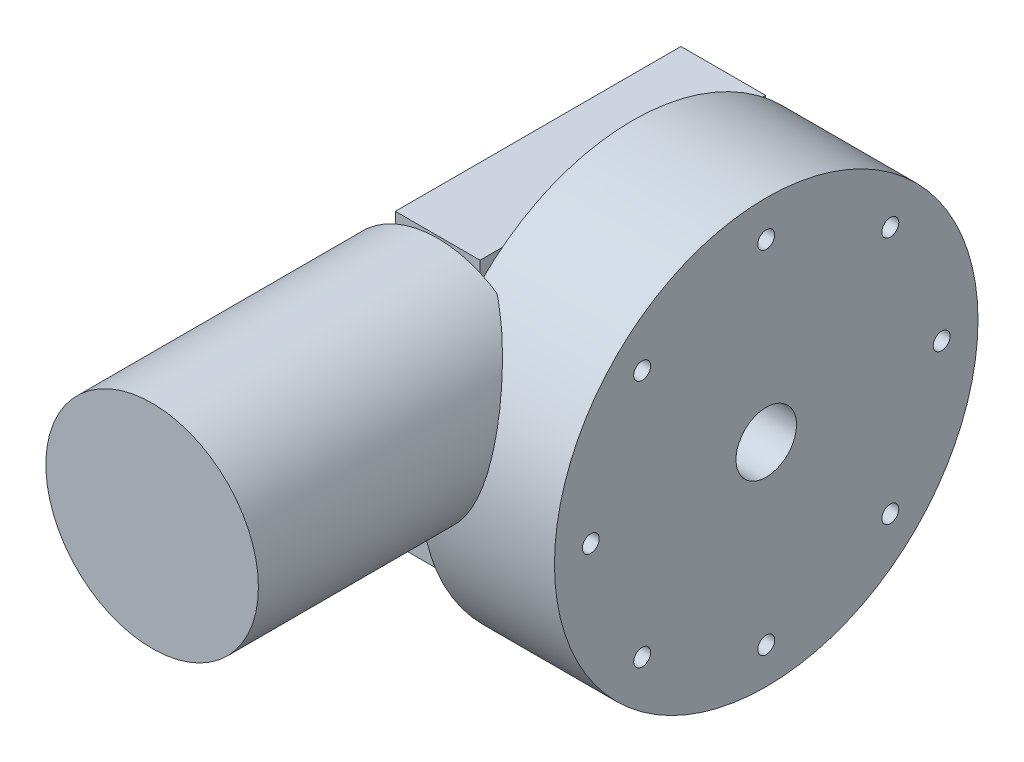
ISO-10303-21;
HEADER;
FILE_DESCRIPTION(('STEP AP214'),'2;1');
FILE_NAME('part.step','',(''),(''),'','','');
FILE_SCHEMA(('AUTOMOTIVE_DESIGN { 1 0 10303 214 1 1 1 1 }'));
ENDSEC;
DATA;
#1=APPLICATION_CONTEXT('core data for automotive mechanical design processes');
#2=APPLICATION_PROTOCOL_DEFINITION('international standard','automotive_design',2000,#1);
#3=PRODUCT_CONTEXT('',#1,'mechanical');
#4=PRODUCT('Part','Part','',(#3));
#5=PRODUCT_RELATED_PRODUCT_CATEGORY('part','',(#4));
#6=PRODUCT_DEFINITION_FORMATION('','',#4);
#7=PRODUCT_DEFINITION_CONTEXT('part definition',#1,'design');
#8=PRODUCT_DEFINITION('design','',#6,#7);
#9=PRODUCT_DEFINITION_SHAPE('','',#8);
#10=(LENGTH_UNIT() NAMED_UNIT(*) SI_UNIT(.MILLI.,.METRE.));
#11=(NAMED_UNIT(*) PLANE_ANGLE_UNIT() SI_UNIT($,.RADIAN.));
#12=(NAMED_UNIT(*) SI_UNIT($,.STERADIAN.) SOLID_ANGLE_UNIT());
#13=UNCERTAINTY_MEASURE_WITH_UNIT(LENGTH_MEASURE(1.E-05),#10,'distance_accuracy_value','');
#14=(GEOMETRIC_REPRESENTATION_CONTEXT(3) GLOBAL_UNCERTAINTY_ASSIGNED_CONTEXT((#13)) GLOBAL_UNIT_ASSIGNED_CONTEXT((#10,
#11,#12)) REPRESENTATION_CONTEXT('',''));
#15=CARTESIAN_POINT('',(0.,0.,0.));
#16=DIRECTION('',(0.,0.,1.));
#17=DIRECTION('',(1.,0.,0.));
#18=AXIS2_PLACEMENT_3D('',#15,#16,#17);
#19=CARTESIAN_POINT('',(-70.,-100.523478567222,126.));
#20=DIRECTION('',(0.,0.,1.));
#21=DIRECTION('',(1.,0.,0.));
#22=AXIS2_PLACEMENT_3D('',#19,#20,#21);
#23=PLANE('',#22);
#24=CARTESIAN_POINT('',(-35.,48.3972012518398,126.));
#25=DIRECTION('',(0.,0.,1.));
#26=DIRECTION('',(1.,0.,0.));
#27=AXIS2_PLACEMENT_3D('',#24,#25,#26);
#28=CIRCLE('',#27,87.8280680463615);
#29=CARTESIAN_POINT('',(0.,128.950100248439,126.));
#30=VERTEX_POINT('',#29);
#31=CARTESIAN_POINT('',(-70.,128.950100248439,126.));
#32=VERTEX_POINT('',#31);
#33=EDGE_CURVE('E52',#30,#32,#28,.T.);
#34=ORIENTED_EDGE('',*,*,#33,.F.);
#35=DIRECTION('',(0.,-1.,0.));
#36=VECTOR('',#35,1.);
#37=CARTESIAN_POINT('',(0.,-100.523478567222,126.));
#38=LINE('',#37,#36);
#39=CARTESIAN_POINT('',(0.,138.,126.));
#40=VERTEX_POINT('',#39);
#41=EDGE_CURVE('E106',#40,#30,#38,.T.);
#42=ORIENTED_EDGE('',*,*,#41,.F.);
#43=DIRECTION('',(1.,0.,0.));
#44=VECTOR('',#43,1.);
#45=CARTESIAN_POINT('',(-70.,138.,126.));
#46=LINE('',#45,#44);
#47=CARTESIAN_POINT('',(-70.,138.,126.));
#48=VERTEX_POINT('',#47);
#49=EDGE_CURVE('E149',#48,#40,#46,.T.);
#50=ORIENTED_EDGE('',*,*,#49,.F.);
#51=DIRECTION('',(0.,-1.,0.));
#52=VECTOR('',#51,1.);
#53=CARTESIAN_POINT('',(-70.,-100.523478567222,126.));
#54=LINE('',#53,#52);
#55=EDGE_CURVE('E137',#48,#32,#54,.T.);
#56=ORIENTED_EDGE('',*,*,#55,.T.);
#57=EDGE_LOOP('',(#34,#42,#50,#56));
#58=FACE_BOUND('',#57,.T.);
#59=ADVANCED_FACE('F41',(#58),#23,.T.);
#60=CARTESIAN_POINT('',(-70.,-100.523478567222,-110.));
#61=DIRECTION('',(0.,0.,-1.));
#62=DIRECTION('',(-1.,0.,0.));
#63=AXIS2_PLACEMENT_3D('',#60,#61,#62);
#64=PLANE('',#63);
#65=DIRECTION('',(0.,1.,0.));
#66=VECTOR('',#65,1.);
#67=CARTESIAN_POINT('',(0.,-100.523478567222,-110.));
#68=LINE('',#67,#66);
#69=CARTESIAN_POINT('',(0.,-100.523478567222,-110.));
#70=VERTEX_POINT('',#69);
#71=CARTESIAN_POINT('',(0.,138.,-110.));
#72=VERTEX_POINT('',#71);
#73=EDGE_CURVE('E143',#70,#72,#68,.T.);
#74=ORIENTED_EDGE('',*,*,#73,.F.);
#75=DIRECTION('',(1.,0.,0.));
#76=VECTOR('',#75,1.);
#77=CARTESIAN_POINT('',(-70.,-100.523478567222,-110.));
#78=LINE('',#77,#76);
#79=CARTESIAN_POINT('',(-70.,-100.523478567222,-110.));
#80=VERTEX_POINT('',#79);
#81=EDGE_CURVE('E50',#80,#70,#78,.T.);
#82=ORIENTED_EDGE('',*,*,#81,.F.);
#83=DIRECTION('',(0.,1.,0.));
#84=VECTOR('',#83,1.);
#85=CARTESIAN_POINT('',(-70.,-100.523478567222,-110.));
#86=LINE('',#85,#84);
#87=CARTESIAN_POINT('',(-70.,138.,-110.));
#88=VERTEX_POINT('',#87);
#89=EDGE_CURVE('E129',#80,#88,#86,.T.);
#90=ORIENTED_EDGE('',*,*,#89,.T.);
#91=DIRECTION('',(1.,0.,0.));
#92=VECTOR('',#91,1.);
#93=CARTESIAN_POINT('',(-70.,138.,-110.));
#94=LINE('',#93,#92);
#95=EDGE_CURVE('E142',#88,#72,#94,.T.);
#96=ORIENTED_EDGE('',*,*,#95,.T.);
#97=EDGE_LOOP('',(#74,#82,#90,#96));
#98=FACE_BOUND('',#97,.T.);
#99=ADVANCED_FACE('F43',(#98),#64,.T.);
#100=CARTESIAN_POINT('',(-70.,-100.523478567222,-110.));
#101=DIRECTION('',(0.,-1.,0.));
#102=DIRECTION('',(0.,0.,-1.));
#103=AXIS2_PLACEMENT_3D('',#100,#101,#102);
#104=PLANE('',#103);
#105=DIRECTION('',(0.,0.,-1.));
#106=VECTOR('',#105,1.);
#107=CARTESIAN_POINT('',(0.,-100.523478567222,-110.));
#108=LINE('',#107,#106);
#109=CARTESIAN_POINT('',(0.,-100.523478567222,126.));
#110=VERTEX_POINT('',#109);
#111=EDGE_CURVE('E133',#110,#70,#108,.T.);
#112=ORIENTED_EDGE('',*,*,#111,.F.);
#113=DIRECTION('',(1.,0.,0.));
#114=VECTOR('',#113,1.);
#115=CARTESIAN_POINT('',(-70.,-100.523478567222,126.));
#116=LINE('',#115,#114);
#117=CARTESIAN_POINT('',(-70.,-100.523478567222,126.));
#118=VERTEX_POINT('',#117);
#119=EDGE_CURVE('E113',#118,#110,#116,.T.);
#120=ORIENTED_EDGE('',*,*,#119,.F.);
#121=DIRECTION('',(0.,0.,-1.));
#122=VECTOR('',#121,1.);
#123=CARTESIAN_POINT('',(-70.,-100.523478567222,-110.));
#124=LINE('',#123,#122);
#125=EDGE_CURVE('E139',#118,#80,#124,.T.);
#126=ORIENTED_EDGE('',*,*,#125,.T.);
#127=ORIENTED_EDGE('',*,*,#81,.T.);
#128=EDGE_LOOP('',(#112,#120,#126,#127));
#129=FACE_BOUND('',#128,.T.);
#130=ADVANCED_FACE('F158',(#129),#104,.T.);
#131=CARTESIAN_POINT('',(-70.,-32.1556977447593,126.));
#132=VERTEX_POINT('',#131);
#133=CARTESIAN_POINT('',(0.,-32.1556977447593,126.));
#134=VERTEX_POINT('',#133);
#135=EDGE_CURVE('E12',#132,#134,#28,.T.);
#136=ORIENTED_EDGE('',*,*,#135,.F.);
#137=EDGE_CURVE('E136',#132,#118,#54,.T.);
#138=ORIENTED_EDGE('',*,*,#137,.T.);
#139=ORIENTED_EDGE('',*,*,#119,.T.);
#140=EDGE_CURVE('E102',#134,#110,#38,.T.);
#141=ORIENTED_EDGE('',*,*,#140,.F.);
#142=EDGE_LOOP('',(#136,#138,#139,#141));
#143=FACE_BOUND('',#142,.T.);
#144=ADVANCED_FACE('F111',(#143),#23,.T.);
#145=CARTESIAN_POINT('',(-70.,138.,-110.));
#146=DIRECTION('',(0.,1.,0.));
#147=DIRECTION('',(0.,0.,1.));
#148=AXIS2_PLACEMENT_3D('',#145,#146,#147);
#149=PLANE('',#148);
#150=DIRECTION('',(0.,0.,1.));
#151=VECTOR('',#150,1.);
#152=CARTESIAN_POINT('',(0.,138.,-110.));
#153=LINE('',#152,#151);
#154=EDGE_CURVE('E115',#72,#40,#153,.T.);
#155=ORIENTED_EDGE('',*,*,#154,.F.);
#156=ORIENTED_EDGE('',*,*,#95,.F.);
#157=DIRECTION('',(0.,0.,1.));
#158=VECTOR('',#157,1.);
#159=CARTESIAN_POINT('',(-70.,138.,-110.));
#160=LINE('',#159,#158);
#161=EDGE_CURVE('E132',#88,#48,#160,.T.);
#162=ORIENTED_EDGE('',*,*,#161,.T.);
#163=ORIENTED_EDGE('',*,*,#49,.T.);
#164=EDGE_LOOP('',(#155,#156,#162,#163));
#165=FACE_BOUND('',#164,.T.);
#166=ADVANCED_FACE('F156',(#165),#149,.T.);
#167=CARTESIAN_POINT('',(-70.,0.,0.));
#168=DIRECTION('',(1.,0.,0.));
#169=DIRECTION('',(0.,0.,-1.));
#170=AXIS2_PLACEMENT_3D('',#167,#168,#169);
#171=PLANE('',#170);
#172=CARTESIAN_POINT('',(-70.,0.,0.));
#173=DIRECTION('',(1.,0.,0.));
#174=DIRECTION('',(0.,0.,-1.));
#175=AXIS2_PLACEMENT_3D('',#172,#173,#174);
#176=CIRCLE('',#175,25.);
#177=CARTESIAN_POINT('',(-70.,0.,-25.));
#178=VERTEX_POINT('',#177);
#179=EDGE_CURVE('E120',#178,#178,#176,.T.);
#180=ORIENTED_EDGE('',*,*,#179,.T.);
#181=EDGE_LOOP('',(#180));
#182=FACE_BOUND('',#181,.T.);
#183=ORIENTED_EDGE('',*,*,#89,.F.);
#184=ORIENTED_EDGE('',*,*,#125,.F.);
#185=ORIENTED_EDGE('',*,*,#137,.F.);
#186=EDGE_CURVE('E65',#32,#132,#54,.T.);
#187=ORIENTED_EDGE('',*,*,#186,.F.);
#188=ORIENTED_EDGE('',*,*,#55,.F.);
#189=ORIENTED_EDGE('',*,*,#161,.F.);
#190=EDGE_LOOP('',(#183,#184,#185,#187,#188,#189));
#191=FACE_BOUND('',#190,.T.);
#192=ADVANCED_FACE('F160',(#182,#191),#171,.F.);
#193=CARTESIAN_POINT('',(0.,0.,0.));
#194=DIRECTION('',(1.,0.,0.));
#195=DIRECTION('',(0.,0.,-1.));
#196=AXIS2_PLACEMENT_3D('',#193,#194,#195);
#197=PLANE('',#196);
#198=CARTESIAN_POINT('',(0.,0.,0.));
#199=DIRECTION('',(1.,0.,0.));
#200=DIRECTION('',(0.,0.,-1.));
#201=AXIS2_PLACEMENT_3D('',#198,#199,#200);
#202=CIRCLE('',#201,25.);
#203=CARTESIAN_POINT('',(0.,0.,-25.));
#204=VERTEX_POINT('',#203);
#205=EDGE_CURVE('E45',#204,#204,#202,.T.);
#206=ORIENTED_EDGE('',*,*,#205,.F.);
#207=EDGE_LOOP('',(#206));
#208=FACE_BOUND('',#207,.T.);
#209=ORIENTED_EDGE('',*,*,#73,.T.);
#210=ORIENTED_EDGE('',*,*,#154,.T.);
#211=ORIENTED_EDGE('',*,*,#41,.T.);
#212=EDGE_CURVE('E98',#30,#134,#38,.T.);
#213=ORIENTED_EDGE('',*,*,#212,.T.);
#214=ORIENTED_EDGE('',*,*,#140,.T.);
#215=ORIENTED_EDGE('',*,*,#111,.T.);
#216=EDGE_LOOP('',(#209,#210,#211,#213,#214,#215));
#217=FACE_BOUND('',#216,.T.);
#218=ADVANCED_FACE('F100',(#208,#217),#197,.T.);
#219=CARTESIAN_POINT('',(-35.,48.3972012518398,126.));
#220=DIRECTION('',(0.,0.,1.));
#221=DIRECTION('',(1.,0.,0.));
#222=AXIS2_PLACEMENT_3D('',#219,#220,#221);
#223=PLANE('',#222);
#224=EDGE_CURVE('E53',#32,#132,#28,.T.);
#225=ORIENTED_EDGE('',*,*,#224,.F.);
#226=ORIENTED_EDGE('',*,*,#186,.T.);
#227=EDGE_LOOP('',(#225,#226));
#228=FACE_BOUND('',#227,.T.);
#229=ADVANCED_FACE('F178',(#228),#223,.F.);
#230=CARTESIAN_POINT('',(-35.,48.3972012518398,362.));
#231=DIRECTION('',(0.,0.,-1.));
#232=DIRECTION('',(-1.,0.,0.));
#233=AXIS2_PLACEMENT_3D('',#230,#231,#232);
#234=CYLINDRICAL_SURFACE('',#233,87.8280680463615);
#235=CARTESIAN_POINT('',(-35.,48.3972012518398,362.));
#236=DIRECTION('',(0.,0.,1.));
#237=DIRECTION('',(1.,0.,0.));
#238=AXIS2_PLACEMENT_3D('',#235,#236,#237);
#239=CIRCLE('',#238,87.8280680463615);
#240=CARTESIAN_POINT('',(52.8280680463615,48.3972012518398,362.));
#241=VERTEX_POINT('',#240);
#242=EDGE_CURVE('E125',#241,#241,#239,.T.);
#243=ORIENTED_EDGE('',*,*,#242,.F.);
#244=EDGE_LOOP('',(#243));
#245=FACE_BOUND('',#244,.T.);
#246=ORIENTED_EDGE('',*,*,#33,.T.);
#247=ORIENTED_EDGE('',*,*,#224,.T.);
#248=ORIENTED_EDGE('',*,*,#135,.T.);
#249=EDGE_CURVE('E116',#134,#30,#28,.T.);
#250=ORIENTED_EDGE('',*,*,#249,.T.);
#251=EDGE_LOOP('',(#246,#247,#248,#250));
#252=FACE_BOUND('',#251,.T.);
#253=ADVANCED_FACE('F122',(#245,#252),#234,.T.);
#254=CARTESIAN_POINT('',(-35.,48.3972012518398,362.));
#255=DIRECTION('',(0.,0.,1.));
#256=DIRECTION('',(1.,0.,0.));
#257=AXIS2_PLACEMENT_3D('',#254,#255,#256);
#258=PLANE('',#257);
#259=ORIENTED_EDGE('',*,*,#242,.T.);
#260=EDGE_LOOP('',(#259));
#261=FACE_BOUND('',#260,.T.);
#262=ADVANCED_FACE('F185',(#261),#258,.T.);
#263=ORIENTED_EDGE('',*,*,#212,.F.);
#264=ORIENTED_EDGE('',*,*,#249,.F.);
#265=EDGE_LOOP('',(#263,#264));
#266=FACE_BOUND('',#265,.T.);
#267=ADVANCED_FACE('F117',(#266),#223,.F.);
#268=CARTESIAN_POINT('',(-122.828068046361,0.,0.));
#269=DIRECTION('',(1.,0.,0.));
#270=DIRECTION('',(0.,0.,-1.));
#271=AXIS2_PLACEMENT_3D('',#268,#269,#270);
#272=CYLINDRICAL_SURFACE('',#271,25.);
#273=CARTESIAN_POINT('',(0.,0.,-25.));
#274=CARTESIAN_POINT('',(-0.729166666666665,0.,-25.));
#275=CARTESIAN_POINT('',(-1.45833333333333,0.,-25.));
#276=CARTESIAN_POINT('',(-2.91666666666666,0.,-25.));
#277=CARTESIAN_POINT('',(-3.64583333333333,0.,-25.));
#278=CARTESIAN_POINT('',(-5.10416666666667,0.,-25.));
#279=CARTESIAN_POINT('',(-5.83333333333333,0.,-25.));
#280=CARTESIAN_POINT('',(-7.29166666666667,0.,-25.));
#281=CARTESIAN_POINT('',(-8.02083333333334,0.,-25.));
#282=CARTESIAN_POINT('',(-9.47916666666667,0.,-25.));
#283=CARTESIAN_POINT('',(-10.2083333333333,0.,-25.));
#284=CARTESIAN_POINT('',(-11.6666666666667,0.,-25.));
#285=CARTESIAN_POINT('',(-12.3958333333333,0.,-25.));
#286=CARTESIAN_POINT('',(-13.8541666666667,0.,-25.));
#287=CARTESIAN_POINT('',(-14.5833333333333,0.,-25.));
#288=CARTESIAN_POINT('',(-16.0416666666667,0.,-25.));
#289=CARTESIAN_POINT('',(-16.7708333333333,0.,-25.));
#290=CARTESIAN_POINT('',(-18.2291666666667,0.,-25.));
#291=CARTESIAN_POINT('',(-18.9583333333333,0.,-25.));
#292=CARTESIAN_POINT('',(-20.4166666666667,0.,-25.));
#293=CARTESIAN_POINT('',(-21.1458333333333,0.,-25.));
#294=CARTESIAN_POINT('',(-22.6041666666667,0.,-25.));
#295=CARTESIAN_POINT('',(-23.3333333333333,0.,-25.));
#296=CARTESIAN_POINT('',(-24.7916666666667,0.,-25.));
#297=CARTESIAN_POINT('',(-25.5208333333333,0.,-25.));
#298=CARTESIAN_POINT('',(-26.9791666666667,0.,-25.));
#299=CARTESIAN_POINT('',(-27.7083333333333,0.,-25.));
#300=CARTESIAN_POINT('',(-29.1666666666667,0.,-25.));
#301=CARTESIAN_POINT('',(-29.8958333333333,0.,-25.));
#302=CARTESIAN_POINT('',(-31.3541666666667,0.,-25.));
#303=CARTESIAN_POINT('',(-32.0833333333333,0.,-25.));
#304=CARTESIAN_POINT('',(-33.5416666666667,0.,-25.));
#305=CARTESIAN_POINT('',(-34.2708333333333,0.,-25.));
#306=CARTESIAN_POINT('',(-35.7291666666667,0.,-25.));
#307=CARTESIAN_POINT('',(-36.4583333333333,0.,-25.));
#308=CARTESIAN_POINT('',(-37.9166666666667,0.,-25.));
#309=CARTESIAN_POINT('',(-38.6458333333333,0.,-25.));
#310=CARTESIAN_POINT('',(-40.1041666666667,0.,-25.));
#311=CARTESIAN_POINT('',(-40.8333333333333,0.,-25.));
#312=CARTESIAN_POINT('',(-42.2916666666667,0.,-25.));
#313=CARTESIAN_POINT('',(-43.0208333333333,0.,-25.));
#314=CARTESIAN_POINT('',(-44.4791666666667,0.,-25.));
#315=CARTESIAN_POINT('',(-45.2083333333333,0.,-25.));
#316=CARTESIAN_POINT('',(-46.6666666666667,0.,-25.));
#317=CARTESIAN_POINT('',(-47.3958333333333,0.,-25.));
#318=CARTESIAN_POINT('',(-48.8541666666667,0.,-25.));
#319=CARTESIAN_POINT('',(-49.5833333333333,0.,-25.));
#320=CARTESIAN_POINT('',(-51.0416666666667,0.,-25.));
#321=CARTESIAN_POINT('',(-51.7708333333333,0.,-25.));
#322=CARTESIAN_POINT('',(-53.2291666666667,0.,-25.));
#323=CARTESIAN_POINT('',(-53.9583333333333,0.,-25.));
#324=CARTESIAN_POINT('',(-55.4166666666667,0.,-25.));
#325=CARTESIAN_POINT('',(-56.1458333333333,0.,-25.));
#326=CARTESIAN_POINT('',(-57.6041666666667,0.,-25.));
#327=CARTESIAN_POINT('',(-58.3333333333333,0.,-25.));
#328=CARTESIAN_POINT('',(-59.7916666666667,0.,-25.));
#329=CARTESIAN_POINT('',(-60.5208333333333,0.,-25.));
#330=CARTESIAN_POINT('',(-61.9791666666667,0.,-25.));
#331=CARTESIAN_POINT('',(-62.7083333333333,0.,-25.));
#332=CARTESIAN_POINT('',(-64.1666666666667,0.,-25.));
#333=CARTESIAN_POINT('',(-64.8958333333333,0.,-25.));
#334=CARTESIAN_POINT('',(-66.3541666666667,0.,-25.));
#335=CARTESIAN_POINT('',(-67.0833333333334,0.,-25.));
#336=CARTESIAN_POINT('',(-68.5416666666667,0.,-25.));
#337=CARTESIAN_POINT('',(-69.2708333333334,0.,-25.));
#338=CARTESIAN_POINT('',(-70.,0.,-25.));
#339=B_SPLINE_CURVE_WITH_KNOTS('',3,(#273,#274,#275,#276,#277,#278,#279,#280,#281,#282,#283,
#284,#285,#286,#287,#288,#289,#290,#291,#292,#293,#294,#295,#296,#297,#298,#299,#300,#301,#302,
#303,#304,#305,#306,#307,#308,#309,#310,#311,#312,#313,#314,#315,#316,#317,#318,#319,#320,#321,
#322,#323,#324,#325,#326,#327,#328,#329,#330,#331,#332,#333,#334,#335,#336,#337,#338),
.UNSPECIFIED.,.F.,.F.,(4,2,2,2,2,2,2,2,2,2,2,2,2,2,2,2,2,2,2,2,2,2,2,2,2,2,2,2,2,2,2,2,4),(0.,
2.1875,4.375,6.5625,8.75000000000001,10.9375,13.125,15.3125,17.5,19.6875,21.875,24.0625,26.25,
28.4375,30.625,32.8125,35.,37.1875,39.375,41.5625,43.75,45.9375,48.125,50.3125,52.5,54.6875,
56.875,59.0625,61.25,63.4375,65.625,67.8125,70.),.UNSPECIFIED.);
#340=EDGE_CURVE('BSEAM189',#204,#178,#339,.T.);
#341=ORIENTED_EDGE('',*,*,#205,.T.);
#342=ORIENTED_EDGE('',*,*,#179,.F.);
#343=ORIENTED_EDGE('',*,*,#340,.T.);
#344=ORIENTED_EDGE('',*,*,#340,.F.);
#345=EDGE_LOOP('',(#341,#343,#342,#344));
#346=FACE_BOUND('',#345,.T.);
#347=ADVANCED_FACE('F189',(#346),#272,.F.);
#348=CLOSED_SHELL('',(#59,#99,#130,#144,#166,#192,#218,#229,#253,#262,#267,#347));
#349=MANIFOLD_SOLID_BREP('B2',#348);
#350=CARTESIAN_POINT('',(110.5,0.,0.));
#351=DIRECTION('',(-1.,0.,0.));
#352=DIRECTION('',(0.,0.,1.));
#353=AXIS2_PLACEMENT_3D('',#350,#351,#352);
#354=CYLINDRICAL_SURFACE('',#353,175.);
#355=CARTESIAN_POINT('',(110.5,0.,0.));
#356=DIRECTION('',(1.,0.,0.));
#357=DIRECTION('',(0.,0.,-1.));
#358=AXIS2_PLACEMENT_3D('',#355,#356,#357);
#359=CIRCLE('',#358,175.);
#360=CARTESIAN_POINT('',(110.5,0.,-175.));
#361=VERTEX_POINT('',#360);
#362=EDGE_CURVE('E40',#361,#361,#359,.T.);
#363=ORIENTED_EDGE('',*,*,#362,.F.);
#364=EDGE_LOOP('',(#363));
#365=FACE_BOUND('',#364,.T.);
#366=CARTESIAN_POINT('',(0.,0.,0.));
#367=DIRECTION('',(1.,0.,0.));
#368=DIRECTION('',(0.,0.,-1.));
#369=AXIS2_PLACEMENT_3D('',#366,#367,#368);
#370=CIRCLE('',#369,175.);
#371=CARTESIAN_POINT('',(0.,0.,-175.));
#372=VERTEX_POINT('',#371);
#373=EDGE_CURVE('E279',#372,#372,#370,.T.);
#374=ORIENTED_EDGE('',*,*,#373,.T.);
#375=EDGE_LOOP('',(#374));
#376=FACE_BOUND('',#375,.T.);
#377=ADVANCED_FACE('F272',(#365,#376),#354,.T.);
#378=CARTESIAN_POINT('',(110.5,0.,0.));
#379=DIRECTION('',(1.,0.,0.));
#380=DIRECTION('',(0.,0.,-1.));
#381=AXIS2_PLACEMENT_3D('',#378,#379,#380);
#382=PLANE('',#381);
#383=CARTESIAN_POINT('',(110.5,0.,0.));
#384=DIRECTION('',(1.,0.,0.));
#385=DIRECTION('',(0.,0.,-1.));
#386=AXIS2_PLACEMENT_3D('',#383,#384,#385);
#387=CIRCLE('',#386,25.);
#388=CARTESIAN_POINT('',(110.5,0.,-25.));
#389=VERTEX_POINT('',#388);
#390=EDGE_CURVE('E333',#389,#389,#387,.T.);
#391=ORIENTED_EDGE('',*,*,#390,.F.);
#392=EDGE_LOOP('',(#391));
#393=FACE_BOUND('',#392,.T.);
#394=CARTESIAN_POINT('',(110.5,-5.06264794132254E-13,145.));
#395=DIRECTION('',(-1.,0.,0.));
#396=DIRECTION('',(0.,-1.,0.));
#397=AXIS2_PLACEMENT_3D('',#394,#395,#396);
#398=CIRCLE('',#397,7.);
#399=CARTESIAN_POINT('',(110.5,-7.00000000000051,145.));
#400=VERTEX_POINT('',#399);
#401=EDGE_CURVE('E295',#400,#400,#398,.T.);
#402=ORIENTED_EDGE('',*,*,#401,.T.);
#403=EDGE_LOOP('',(#402));
#404=FACE_BOUND('',#403,.T.);
#405=CARTESIAN_POINT('',(110.5,-102.53048327205,102.530483272049));
#406=DIRECTION('',(-1.,0.,0.));
#407=DIRECTION('',(0.,-0.707106781186544,-0.707106781186551));
#408=AXIS2_PLACEMENT_3D('',#405,#406,#407);
#409=CIRCLE('',#408,7.);
#410=CARTESIAN_POINT('',(110.5,-107.480230740356,97.580735803743));
#411=VERTEX_POINT('',#410);
#412=EDGE_CURVE('E314',#411,#411,#409,.T.);
#413=ORIENTED_EDGE('',*,*,#412,.T.);
#414=EDGE_LOOP('',(#413));
#415=FACE_BOUND('',#414,.T.);
#416=CARTESIAN_POINT('',(110.5,-145.,0.));
#417=DIRECTION('',(-1.,0.,0.));
#418=DIRECTION('',(0.,0.,-1.));
#419=AXIS2_PLACEMENT_3D('',#416,#417,#418);
#420=CIRCLE('',#419,7.);
#421=CARTESIAN_POINT('',(110.5,-145.,-7.));
#422=VERTEX_POINT('',#421);
#423=EDGE_CURVE('E308',#422,#422,#420,.T.);
#424=ORIENTED_EDGE('',*,*,#423,.T.);
#425=EDGE_LOOP('',(#424));
#426=FACE_BOUND('',#425,.T.);
#427=CARTESIAN_POINT('',(110.5,-102.530483272048,-102.53048327205));
#428=DIRECTION('',(-1.,0.,0.));
#429=DIRECTION('',(0.,0.707106781186554,-0.707106781186541));
#430=AXIS2_PLACEMENT_3D('',#427,#428,#429);
#431=CIRCLE('',#430,7.);
#432=CARTESIAN_POINT('',(110.5,-97.5807358037426,-107.480230740356));
#433=VERTEX_POINT('',#432);
#434=EDGE_CURVE('E301',#433,#433,#431,.T.);
#435=ORIENTED_EDGE('',*,*,#434,.T.);
#436=EDGE_LOOP('',(#435));
#437=FACE_BOUND('',#436,.T.);
#438=CARTESIAN_POINT('',(110.5,1.51879438239676E-12,-145.));
#439=DIRECTION('',(-1.,0.,0.));
#440=DIRECTION('',(0.,1.,0.));
#441=AXIS2_PLACEMENT_3D('',#438,#439,#440);
#442=CIRCLE('',#441,7.);
#443=CARTESIAN_POINT('',(110.5,7.00000000000152,-145.));
#444=VERTEX_POINT('',#443);
#445=EDGE_CURVE('E302',#444,#444,#442,.T.);
#446=ORIENTED_EDGE('',*,*,#445,.T.);
#447=EDGE_LOOP('',(#446));
#448=FACE_BOUND('',#447,.T.);
#449=CARTESIAN_POINT('',(110.5,102.530483272051,-102.530483272048));
#450=DIRECTION('',(-1.,0.,0.));
#451=DIRECTION('',(0.,0.707106781186539,0.707106781186556));
#452=AXIS2_PLACEMENT_3D('',#449,#450,#451);
#453=CIRCLE('',#452,7.);
#454=CARTESIAN_POINT('',(110.5,107.480230740356,-97.5807358037422));
#455=VERTEX_POINT('',#454);
#456=EDGE_CURVE('E325',#455,#455,#453,.T.);
#457=ORIENTED_EDGE('',*,*,#456,.T.);
#458=EDGE_LOOP('',(#457));
#459=FACE_BOUND('',#458,.T.);
#460=CARTESIAN_POINT('',(110.5,102.530483272049,102.53048327205));
#461=DIRECTION('',(-1.,0.,0.));
#462=DIRECTION('',(0.,-0.707106781186549,0.707106781186546));
#463=AXIS2_PLACEMENT_3D('',#460,#461,#462);
#464=CIRCLE('',#463,7.);
#465=CARTESIAN_POINT('',(110.5,97.5807358037434,107.480230740355));
#466=VERTEX_POINT('',#465);
#467=EDGE_CURVE('E289',#466,#466,#464,.T.);
#468=ORIENTED_EDGE('',*,*,#467,.T.);
#469=EDGE_LOOP('',(#468));
#470=FACE_BOUND('',#469,.T.);
#471=CARTESIAN_POINT('',(110.5,145.,0.));
#472=DIRECTION('',(-1.,0.,0.));
#473=DIRECTION('',(0.,0.,1.));
#474=AXIS2_PLACEMENT_3D('',#471,#472,#473);
#475=CIRCLE('',#474,7.);
#476=CARTESIAN_POINT('',(110.5,145.,7.));
#477=VERTEX_POINT('',#476);
#478=EDGE_CURVE('E284',#477,#477,#475,.T.);
#479=ORIENTED_EDGE('',*,*,#478,.T.);
#480=EDGE_LOOP('',(#479));
#481=FACE_BOUND('',#480,.T.);
#482=ORIENTED_EDGE('',*,*,#362,.T.);
#483=EDGE_LOOP('',(#482));
#484=FACE_BOUND('',#483,.T.);
#485=ADVANCED_FACE('F355',(#393,#404,#415,#426,#437,#448,#459,#470,#481,#484),#382,.T.);
#486=CARTESIAN_POINT('',(0.,0.,0.));
#487=DIRECTION('',(1.,0.,0.));
#488=DIRECTION('',(0.,0.,-1.));
#489=AXIS2_PLACEMENT_3D('',#486,#487,#488);
#490=PLANE('',#489);
#491=CARTESIAN_POINT('',(0.,0.,0.));
#492=DIRECTION('',(1.,0.,0.));
#493=DIRECTION('',(0.,0.,-1.));
#494=AXIS2_PLACEMENT_3D('',#491,#492,#493);
#495=CIRCLE('',#494,25.);
#496=CARTESIAN_POINT('',(0.,0.,-25.));
#497=VERTEX_POINT('',#496);
#498=EDGE_CURVE('E275',#497,#497,#495,.T.);
#499=ORIENTED_EDGE('',*,*,#498,.T.);
#500=EDGE_LOOP('',(#499));
#501=FACE_BOUND('',#500,.T.);
#502=CARTESIAN_POINT('',(0.,-5.06264794132254E-13,145.));
#503=DIRECTION('',(-1.,0.,0.));
#504=DIRECTION('',(0.,-1.,0.));
#505=AXIS2_PLACEMENT_3D('',#502,#503,#504);
#506=CIRCLE('',#505,7.);
#507=CARTESIAN_POINT('',(0.,-7.00000000000051,145.));
#508=VERTEX_POINT('',#507);
#509=EDGE_CURVE('E317',#508,#508,#506,.T.);
#510=ORIENTED_EDGE('',*,*,#509,.F.);
#511=EDGE_LOOP('',(#510));
#512=FACE_BOUND('',#511,.T.);
#513=CARTESIAN_POINT('',(0.,-102.53048327205,102.530483272049));
#514=DIRECTION('',(-1.,0.,0.));
#515=DIRECTION('',(0.,-0.707106781186544,-0.707106781186551));
#516=AXIS2_PLACEMENT_3D('',#513,#514,#515);
#517=CIRCLE('',#516,7.);
#518=CARTESIAN_POINT('',(0.,-107.480230740356,97.580735803743));
#519=VERTEX_POINT('',#518);
#520=EDGE_CURVE('E311',#519,#519,#517,.T.);
#521=ORIENTED_EDGE('',*,*,#520,.F.);
#522=EDGE_LOOP('',(#521));
#523=FACE_BOUND('',#522,.T.);
#524=CARTESIAN_POINT('',(0.,-145.,0.));
#525=DIRECTION('',(-1.,0.,0.));
#526=DIRECTION('',(0.,0.,-1.));
#527=AXIS2_PLACEMENT_3D('',#524,#525,#526);
#528=CIRCLE('',#527,7.);
#529=CARTESIAN_POINT('',(0.,-145.,-7.));
#530=VERTEX_POINT('',#529);
#531=EDGE_CURVE('E305',#530,#530,#528,.T.);
#532=ORIENTED_EDGE('',*,*,#531,.F.);
#533=EDGE_LOOP('',(#532));
#534=FACE_BOUND('',#533,.T.);
#535=CARTESIAN_POINT('',(0.,-102.530483272048,-102.53048327205));
#536=DIRECTION('',(-1.,0.,0.));
#537=DIRECTION('',(0.,0.707106781186554,-0.707106781186541));
#538=AXIS2_PLACEMENT_3D('',#535,#536,#537);
#539=CIRCLE('',#538,7.);
#540=CARTESIAN_POINT('',(0.,-97.5807358037426,-107.480230740356));
#541=VERTEX_POINT('',#540);
#542=EDGE_CURVE('E298',#541,#541,#539,.T.);
#543=ORIENTED_EDGE('',*,*,#542,.F.);
#544=EDGE_LOOP('',(#543));
#545=FACE_BOUND('',#544,.T.);
#546=CARTESIAN_POINT('',(0.,1.51879438239676E-12,-145.));
#547=DIRECTION('',(-1.,0.,0.));
#548=DIRECTION('',(0.,1.,0.));
#549=AXIS2_PLACEMENT_3D('',#546,#547,#548);
#550=CIRCLE('',#549,7.);
#551=CARTESIAN_POINT('',(0.,7.00000000000152,-145.));
#552=VERTEX_POINT('',#551);
#553=EDGE_CURVE('E328',#552,#552,#550,.T.);
#554=ORIENTED_EDGE('',*,*,#553,.F.);
#555=EDGE_LOOP('',(#554));
#556=FACE_BOUND('',#555,.T.);
#557=CARTESIAN_POINT('',(0.,102.530483272051,-102.530483272048));
#558=DIRECTION('',(-1.,0.,0.));
#559=DIRECTION('',(0.,0.707106781186539,0.707106781186556));
#560=AXIS2_PLACEMENT_3D('',#557,#558,#559);
#561=CIRCLE('',#560,7.);
#562=CARTESIAN_POINT('',(0.,107.480230740356,-97.5807358037422));
#563=VERTEX_POINT('',#562);
#564=EDGE_CURVE('E322',#563,#563,#561,.T.);
#565=ORIENTED_EDGE('',*,*,#564,.F.);
#566=EDGE_LOOP('',(#565));
#567=FACE_BOUND('',#566,.T.);
#568=CARTESIAN_POINT('',(0.,102.530483272049,102.53048327205));
#569=DIRECTION('',(-1.,0.,0.));
#570=DIRECTION('',(0.,-0.707106781186549,0.707106781186546));
#571=AXIS2_PLACEMENT_3D('',#568,#569,#570);
#572=CIRCLE('',#571,7.);
#573=CARTESIAN_POINT('',(0.,97.5807358037434,107.480230740355));
#574=VERTEX_POINT('',#573);
#575=EDGE_CURVE('E292',#574,#574,#572,.T.);
#576=ORIENTED_EDGE('',*,*,#575,.F.);
#577=EDGE_LOOP('',(#576));
#578=FACE_BOUND('',#577,.T.);
#579=CARTESIAN_POINT('',(0.,145.,0.));
#580=DIRECTION('',(-1.,0.,0.));
#581=DIRECTION('',(0.,0.,1.));
#582=AXIS2_PLACEMENT_3D('',#579,#580,#581);
#583=CIRCLE('',#582,7.);
#584=CARTESIAN_POINT('',(0.,145.,7.));
#585=VERTEX_POINT('',#584);
#586=EDGE_CURVE('E286',#585,#585,#583,.T.);
#587=ORIENTED_EDGE('',*,*,#586,.F.);
#588=EDGE_LOOP('',(#587));
#589=FACE_BOUND('',#588,.T.);
#590=ORIENTED_EDGE('',*,*,#373,.F.);
#591=EDGE_LOOP('',(#590));
#592=FACE_BOUND('',#591,.T.);
#593=ADVANCED_FACE('F340',(#501,#512,#523,#534,#545,#556,#567,#578,#589,#592),#490,.F.);
#594=CARTESIAN_POINT('',(110.5,145.,0.));
#595=DIRECTION('',(-1.,0.,0.));
#596=DIRECTION('',(0.,0.,1.));
#597=AXIS2_PLACEMENT_3D('',#594,#595,#596);
#598=CYLINDRICAL_SURFACE('',#597,7.);
#599=ORIENTED_EDGE('',*,*,#478,.F.);
#600=EDGE_LOOP('',(#599));
#601=FACE_BOUND('',#600,.T.);
#602=ORIENTED_EDGE('',*,*,#586,.T.);
#603=EDGE_LOOP('',(#602));
#604=FACE_BOUND('',#603,.T.);
#605=ADVANCED_FACE('F366',(#601,#604),#598,.F.);
#606=CARTESIAN_POINT('',(110.5,102.530483272049,102.53048327205));
#607=DIRECTION('',(-1.,0.,0.));
#608=DIRECTION('',(0.,0.,1.));
#609=AXIS2_PLACEMENT_3D('',#606,#607,#608);
#610=CYLINDRICAL_SURFACE('',#609,7.);
#611=ORIENTED_EDGE('',*,*,#467,.F.);
#612=EDGE_LOOP('',(#611));
#613=FACE_BOUND('',#612,.T.);
#614=ORIENTED_EDGE('',*,*,#575,.T.);
#615=EDGE_LOOP('',(#614));
#616=FACE_BOUND('',#615,.T.);
#617=ADVANCED_FACE('F370',(#613,#616),#610,.F.);
#618=CARTESIAN_POINT('',(110.5,102.530483272051,-102.530483272048));
#619=DIRECTION('',(-1.,0.,0.));
#620=DIRECTION('',(0.,0.,1.));
#621=AXIS2_PLACEMENT_3D('',#618,#619,#620);
#622=CYLINDRICAL_SURFACE('',#621,7.);
#623=ORIENTED_EDGE('',*,*,#456,.F.);
#624=EDGE_LOOP('',(#623));
#625=FACE_BOUND('',#624,.T.);
#626=ORIENTED_EDGE('',*,*,#564,.T.);
#627=EDGE_LOOP('',(#626));
#628=FACE_BOUND('',#627,.T.);
#629=ADVANCED_FACE('F376',(#625,#628),#622,.F.);
#630=CARTESIAN_POINT('',(110.5,1.51879438239676E-12,-145.));
#631=DIRECTION('',(-1.,0.,0.));
#632=DIRECTION('',(0.,0.,1.));
#633=AXIS2_PLACEMENT_3D('',#630,#631,#632);
#634=CYLINDRICAL_SURFACE('',#633,7.);
#635=ORIENTED_EDGE('',*,*,#445,.F.);
#636=EDGE_LOOP('',(#635));
#637=FACE_BOUND('',#636,.T.);
#638=ORIENTED_EDGE('',*,*,#553,.T.);
#639=EDGE_LOOP('',(#638));
#640=FACE_BOUND('',#639,.T.);
#641=ADVANCED_FACE('F382',(#637,#640),#634,.F.);
#642=CARTESIAN_POINT('',(110.5,-102.530483272048,-102.53048327205));
#643=DIRECTION('',(-1.,0.,0.));
#644=DIRECTION('',(0.,0.,1.));
#645=AXIS2_PLACEMENT_3D('',#642,#643,#644);
#646=CYLINDRICAL_SURFACE('',#645,7.);
#647=ORIENTED_EDGE('',*,*,#434,.F.);
#648=EDGE_LOOP('',(#647));
#649=FACE_BOUND('',#648,.T.);
#650=ORIENTED_EDGE('',*,*,#542,.T.);
#651=EDGE_LOOP('',(#650));
#652=FACE_BOUND('',#651,.T.);
#653=ADVANCED_FACE('F378',(#649,#652),#646,.F.);
#654=CARTESIAN_POINT('',(110.5,-145.,0.));
#655=DIRECTION('',(-1.,0.,0.));
#656=DIRECTION('',(0.,0.,1.));
#657=AXIS2_PLACEMENT_3D('',#654,#655,#656);
#658=CYLINDRICAL_SURFACE('',#657,7.);
#659=ORIENTED_EDGE('',*,*,#423,.F.);
#660=EDGE_LOOP('',(#659));
#661=FACE_BOUND('',#660,.T.);
#662=ORIENTED_EDGE('',*,*,#531,.T.);
#663=EDGE_LOOP('',(#662));
#664=FACE_BOUND('',#663,.T.);
#665=ADVANCED_FACE('F381',(#661,#664),#658,.F.);
#666=CARTESIAN_POINT('',(110.5,-102.53048327205,102.530483272049));
#667=DIRECTION('',(-1.,0.,0.));
#668=DIRECTION('',(0.,0.,1.));
#669=AXIS2_PLACEMENT_3D('',#666,#667,#668);
#670=CYLINDRICAL_SURFACE('',#669,7.);
#671=ORIENTED_EDGE('',*,*,#412,.F.);
#672=EDGE_LOOP('',(#671));
#673=FACE_BOUND('',#672,.T.);
#674=ORIENTED_EDGE('',*,*,#520,.T.);
#675=EDGE_LOOP('',(#674));
#676=FACE_BOUND('',#675,.T.);
#677=ADVANCED_FACE('F350',(#673,#676),#670,.F.);
#678=CARTESIAN_POINT('',(110.5,-5.06264794132254E-13,145.));
#679=DIRECTION('',(-1.,0.,0.));
#680=DIRECTION('',(0.,0.,1.));
#681=AXIS2_PLACEMENT_3D('',#678,#679,#680);
#682=CYLINDRICAL_SURFACE('',#681,7.);
#683=ORIENTED_EDGE('',*,*,#401,.F.);
#684=EDGE_LOOP('',(#683));
#685=FACE_BOUND('',#684,.T.);
#686=ORIENTED_EDGE('',*,*,#509,.T.);
#687=EDGE_LOOP('',(#686));
#688=FACE_BOUND('',#687,.T.);
#689=ADVANCED_FACE('F345',(#685,#688),#682,.F.);
#690=CARTESIAN_POINT('',(-122.828068046361,0.,0.));
#691=DIRECTION('',(1.,0.,0.));
#692=DIRECTION('',(0.,0.,-1.));
#693=AXIS2_PLACEMENT_3D('',#690,#691,#692);
#694=CYLINDRICAL_SURFACE('',#693,25.);
#695=CARTESIAN_POINT('',(110.5,0.,-25.));
#696=CARTESIAN_POINT('',(109.348958333333,0.,-25.));
#697=CARTESIAN_POINT('',(108.197916666667,0.,-25.));
#698=CARTESIAN_POINT('',(105.895833333333,0.,-25.));
#699=CARTESIAN_POINT('',(104.744791666667,0.,-25.));
#700=CARTESIAN_POINT('',(102.442708333333,0.,-25.));
#701=CARTESIAN_POINT('',(101.291666666667,0.,-25.));
#702=CARTESIAN_POINT('',(98.9895833333333,0.,-25.));
#703=CARTESIAN_POINT('',(97.8385416666666,0.,-25.));
#704=CARTESIAN_POINT('',(95.5364583333333,0.,-25.));
#705=CARTESIAN_POINT('',(94.3854166666666,0.,-25.));
#706=CARTESIAN_POINT('',(92.0833333333333,0.,-25.));
#707=CARTESIAN_POINT('',(90.9322916666666,0.,-25.));
#708=CARTESIAN_POINT('',(88.6302083333333,0.,-25.));
#709=CARTESIAN_POINT('',(87.4791666666666,0.,-25.));
#710=CARTESIAN_POINT('',(85.1770833333333,0.,-25.));
#711=CARTESIAN_POINT('',(84.0260416666666,0.,-25.));
#712=CARTESIAN_POINT('',(81.7239583333333,0.,-25.));
#713=CARTESIAN_POINT('',(80.5729166666666,0.,-25.));
#714=CARTESIAN_POINT('',(78.2708333333333,0.,-25.));
#715=CARTESIAN_POINT('',(77.1197916666666,0.,-25.));
#716=CARTESIAN_POINT('',(74.8177083333333,0.,-25.));
#717=CARTESIAN_POINT('',(73.6666666666666,0.,-25.));
#718=CARTESIAN_POINT('',(71.3645833333333,0.,-25.));
#719=CARTESIAN_POINT('',(70.2135416666667,0.,-25.));
#720=CARTESIAN_POINT('',(67.9114583333333,0.,-25.));
#721=CARTESIAN_POINT('',(66.7604166666667,0.,-25.));
#722=CARTESIAN_POINT('',(64.4583333333333,0.,-25.));
#723=CARTESIAN_POINT('',(63.3072916666667,0.,-25.));
#724=CARTESIAN_POINT('',(61.0052083333333,0.,-25.));
#725=CARTESIAN_POINT('',(59.8541666666666,0.,-25.));
#726=CARTESIAN_POINT('',(57.5520833333333,0.,-25.));
#727=CARTESIAN_POINT('',(56.4010416666666,0.,-25.));
#728=CARTESIAN_POINT('',(54.0989583333333,0.,-25.));
#729=CARTESIAN_POINT('',(52.9479166666666,0.,-25.));
#730=CARTESIAN_POINT('',(50.6458333333333,0.,-25.));
#731=CARTESIAN_POINT('',(49.4947916666666,0.,-25.));
#732=CARTESIAN_POINT('',(47.1927083333333,0.,-25.));
#733=CARTESIAN_POINT('',(46.0416666666666,0.,-25.));
#734=CARTESIAN_POINT('',(43.7395833333333,0.,-25.));
#735=CARTESIAN_POINT('',(42.5885416666666,0.,-25.));
#736=CARTESIAN_POINT('',(40.2864583333333,0.,-25.));
#737=CARTESIAN_POINT('',(39.1354166666667,0.,-25.));
#738=CARTESIAN_POINT('',(36.8333333333333,0.,-25.));
#739=CARTESIAN_POINT('',(35.6822916666667,0.,-25.));
#740=CARTESIAN_POINT('',(33.3802083333333,0.,-25.));
#741=CARTESIAN_POINT('',(32.2291666666667,0.,-25.));
#742=CARTESIAN_POINT('',(29.9270833333333,0.,-25.));
#743=CARTESIAN_POINT('',(28.7760416666667,0.,-25.));
#744=CARTESIAN_POINT('',(26.4739583333333,0.,-25.));
#745=CARTESIAN_POINT('',(25.3229166666667,0.,-25.));
#746=CARTESIAN_POINT('',(23.0208333333333,0.,-25.));
#747=CARTESIAN_POINT('',(21.8697916666667,0.,-25.));
#748=CARTESIAN_POINT('',(19.5677083333333,0.,-25.));
#749=CARTESIAN_POINT('',(18.4166666666667,0.,-25.));
#750=CARTESIAN_POINT('',(16.1145833333333,0.,-25.));
#751=CARTESIAN_POINT('',(14.9635416666667,0.,-25.));
#752=CARTESIAN_POINT('',(12.6614583333333,0.,-25.));
#753=CARTESIAN_POINT('',(11.5104166666667,0.,-25.));
#754=CARTESIAN_POINT('',(9.20833333333332,0.,-25.));
#755=CARTESIAN_POINT('',(8.05729166666666,0.,-25.));
#756=CARTESIAN_POINT('',(5.75520833333332,0.,-25.));
#757=CARTESIAN_POINT('',(4.60416666666665,0.,-25.));
#758=CARTESIAN_POINT('',(2.30208333333333,0.,-25.));
#759=CARTESIAN_POINT('',(1.15104166666666,0.,-25.));
#760=CARTESIAN_POINT('',(0.,0.,-25.));
#761=B_SPLINE_CURVE_WITH_KNOTS('',3,(#695,#696,#697,#698,#699,#700,#701,#702,#703,#704,#705,
#706,#707,#708,#709,#710,#711,#712,#713,#714,#715,#716,#717,#718,#719,#720,#721,#722,#723,#724,
#725,#726,#727,#728,#729,#730,#731,#732,#733,#734,#735,#736,#737,#738,#739,#740,#741,#742,#743,
#744,#745,#746,#747,#748,#749,#750,#751,#752,#753,#754,#755,#756,#757,#758,#759,#760),
.UNSPECIFIED.,.F.,.F.,(4,2,2,2,2,2,2,2,2,2,2,2,2,2,2,2,2,2,2,2,2,2,2,2,2,2,2,2,2,2,2,2,4),(0.,
3.453125,6.90625,10.359375,13.8125,17.265625,20.71875,24.171875,27.625,31.078125,34.53125,
37.984375,41.4375,44.890625,48.34375,51.796875,55.25,58.703125,62.15625,65.609375,69.0625,
72.515625,75.96875,79.421875,82.875,86.328125,89.78125,93.234375,96.6875,100.140625,103.59375,
107.046875,110.5),.UNSPECIFIED.);
#762=EDGE_CURVE('BSEAM343',#389,#497,#761,.T.);
#763=ORIENTED_EDGE('',*,*,#390,.T.);
#764=ORIENTED_EDGE('',*,*,#498,.F.);
#765=ORIENTED_EDGE('',*,*,#762,.T.);
#766=ORIENTED_EDGE('',*,*,#762,.F.);
#767=EDGE_LOOP('',(#763,#765,#764,#766));
#768=FACE_BOUND('',#767,.T.);
#769=ADVANCED_FACE('F343',(#768),#694,.F.);
#770=CLOSED_SHELL('',(#377,#485,#593,#605,#617,#629,#641,#653,#665,#677,#689,#769));
#771=MANIFOLD_SOLID_BREP('B6',#770);
#772=ADVANCED_BREP_SHAPE_REPRESENTATION('',(#18,#349,#771),#14);
#773=SHAPE_DEFINITION_REPRESENTATION(#9,#772);
ENDSEC;
END-ISO-10303-21;
